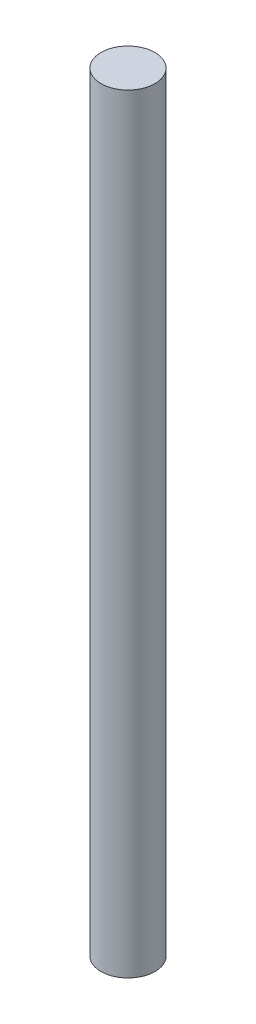
ISO-10303-21;
HEADER;
FILE_DESCRIPTION(('STEP AP214'),'2;1');
FILE_NAME('part.step','',(''),(''),'','','');
FILE_SCHEMA(('AUTOMOTIVE_DESIGN { 1 0 10303 214 1 1 1 1 }'));
ENDSEC;
DATA;
#1=APPLICATION_CONTEXT('core data for automotive mechanical design processes');
#2=APPLICATION_PROTOCOL_DEFINITION('international standard','automotive_design',2000,#1);
#3=PRODUCT_CONTEXT('',#1,'mechanical');
#4=PRODUCT('Part','Part','',(#3));
#5=PRODUCT_RELATED_PRODUCT_CATEGORY('part','',(#4));
#6=PRODUCT_DEFINITION_FORMATION('','',#4);
#7=PRODUCT_DEFINITION_CONTEXT('part definition',#1,'design');
#8=PRODUCT_DEFINITION('design','',#6,#7);
#9=PRODUCT_DEFINITION_SHAPE('','',#8);
#10=(LENGTH_UNIT() NAMED_UNIT(*) SI_UNIT(.MILLI.,.METRE.));
#11=(NAMED_UNIT(*) PLANE_ANGLE_UNIT() SI_UNIT($,.RADIAN.));
#12=(NAMED_UNIT(*) SI_UNIT($,.STERADIAN.) SOLID_ANGLE_UNIT());
#13=UNCERTAINTY_MEASURE_WITH_UNIT(LENGTH_MEASURE(1.E-05),#10,'distance_accuracy_value','');
#14=(GEOMETRIC_REPRESENTATION_CONTEXT(3) GLOBAL_UNCERTAINTY_ASSIGNED_CONTEXT((#13)) GLOBAL_UNIT_ASSIGNED_CONTEXT((#10,
#11,#12)) REPRESENTATION_CONTEXT('',''));
#15=CARTESIAN_POINT('',(0.,0.,0.));
#16=DIRECTION('',(0.,0.,1.));
#17=DIRECTION('',(1.,0.,0.));
#18=AXIS2_PLACEMENT_3D('',#15,#16,#17);
#19=CARTESIAN_POINT('',(0.,180.975,0.));
#20=DIRECTION('',(0.,-1.,0.));
#21=DIRECTION('',(0.,0.,-1.));
#22=AXIS2_PLACEMENT_3D('',#19,#20,#21);
#23=CYLINDRICAL_SURFACE('',#22,6.35);
#24=CARTESIAN_POINT('',(0.,180.975,0.));
#25=DIRECTION('',(0.,1.,0.));
#26=DIRECTION('',(0.,0.,1.));
#27=AXIS2_PLACEMENT_3D('',#24,#25,#26);
#28=CIRCLE('',#27,6.35);
#29=CARTESIAN_POINT('',(0.,180.975,6.35));
#30=VERTEX_POINT('',#29);
#31=EDGE_CURVE('E10',#30,#30,#28,.T.);
#32=ORIENTED_EDGE('',*,*,#31,.F.);
#33=EDGE_LOOP('',(#32));
#34=FACE_BOUND('',#33,.T.);
#35=CARTESIAN_POINT('',(0.,0.,0.));
#36=DIRECTION('',(0.,1.,0.));
#37=DIRECTION('',(0.,0.,1.));
#38=AXIS2_PLACEMENT_3D('',#35,#36,#37);
#39=CIRCLE('',#38,6.35);
#40=CARTESIAN_POINT('',(0.,0.,6.35));
#41=VERTEX_POINT('',#40);
#42=EDGE_CURVE('E37',#41,#41,#39,.T.);
#43=ORIENTED_EDGE('',*,*,#42,.T.);
#44=EDGE_LOOP('',(#43));
#45=FACE_BOUND('',#44,.T.);
#46=ADVANCED_FACE('F40',(#34,#45),#23,.T.);
#47=CARTESIAN_POINT('',(0.,180.975,0.));
#48=DIRECTION('',(0.,1.,0.));
#49=DIRECTION('',(0.,0.,1.));
#50=AXIS2_PLACEMENT_3D('',#47,#48,#49);
#51=PLANE('',#50);
#52=ORIENTED_EDGE('',*,*,#31,.T.);
#53=EDGE_LOOP('',(#52));
#54=FACE_BOUND('',#53,.T.);
#55=ADVANCED_FACE('F55',(#54),#51,.T.);
#56=CARTESIAN_POINT('',(0.,0.,0.));
#57=DIRECTION('',(0.,1.,0.));
#58=DIRECTION('',(0.,0.,1.));
#59=AXIS2_PLACEMENT_3D('',#56,#57,#58);
#60=PLANE('',#59);
#61=ORIENTED_EDGE('',*,*,#42,.F.);
#62=EDGE_LOOP('',(#61));
#63=FACE_BOUND('',#62,.T.);
#64=ADVANCED_FACE('F49',(#63),#60,.F.);
#65=CLOSED_SHELL('',(#46,#55,#64));
#66=MANIFOLD_SOLID_BREP('B2',#65);
#67=ADVANCED_BREP_SHAPE_REPRESENTATION('',(#18,#66),#14);
#68=SHAPE_DEFINITION_REPRESENTATION(#9,#67);
ENDSEC;
END-ISO-10303-21;
